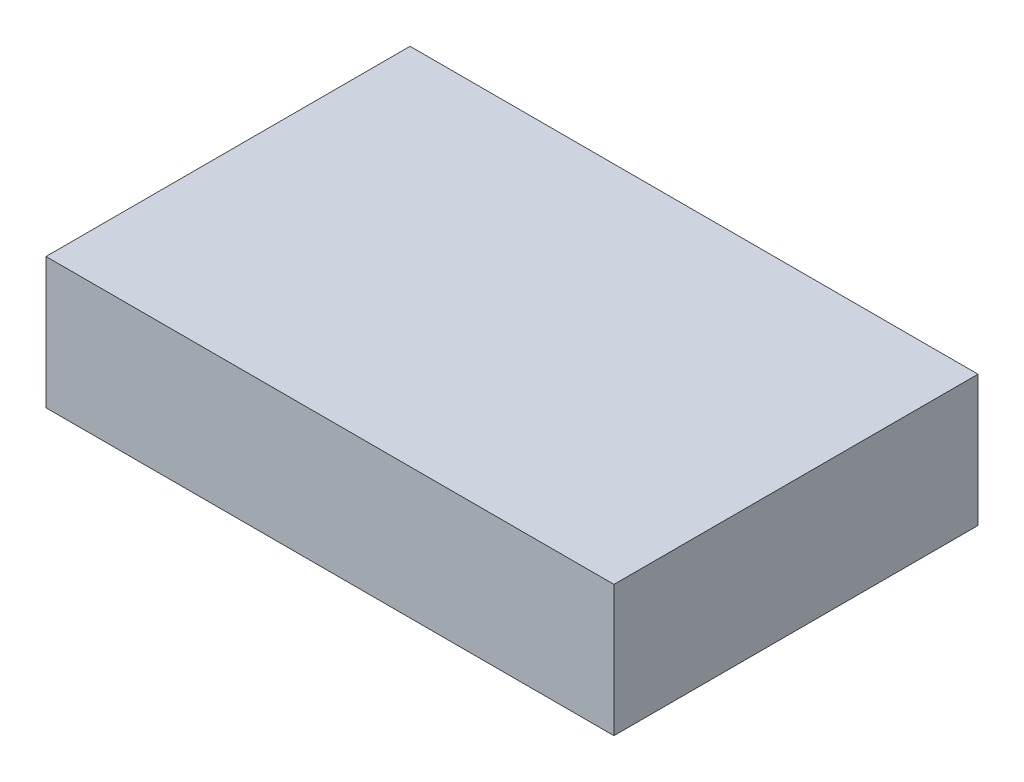
ISO-10303-21;
HEADER;
FILE_DESCRIPTION(('STEP AP214'),'2;1');
FILE_NAME('part.step','',(''),(''),'','','');
FILE_SCHEMA(('AUTOMOTIVE_DESIGN { 1 0 10303 214 1 1 1 1 }'));
ENDSEC;
DATA;
#1=APPLICATION_CONTEXT('core data for automotive mechanical design processes');
#2=APPLICATION_PROTOCOL_DEFINITION('international standard','automotive_design',2000,#1);
#3=PRODUCT_CONTEXT('',#1,'mechanical');
#4=PRODUCT('Part','Part','',(#3));
#5=PRODUCT_RELATED_PRODUCT_CATEGORY('part','',(#4));
#6=PRODUCT_DEFINITION_FORMATION('','',#4);
#7=PRODUCT_DEFINITION_CONTEXT('part definition',#1,'design');
#8=PRODUCT_DEFINITION('design','',#6,#7);
#9=PRODUCT_DEFINITION_SHAPE('','',#8);
#10=(LENGTH_UNIT() NAMED_UNIT(*) SI_UNIT(.MILLI.,.METRE.));
#11=(NAMED_UNIT(*) PLANE_ANGLE_UNIT() SI_UNIT($,.RADIAN.));
#12=(NAMED_UNIT(*) SI_UNIT($,.STERADIAN.) SOLID_ANGLE_UNIT());
#13=UNCERTAINTY_MEASURE_WITH_UNIT(LENGTH_MEASURE(1.E-05),#10,'distance_accuracy_value','');
#14=(GEOMETRIC_REPRESENTATION_CONTEXT(3) GLOBAL_UNCERTAINTY_ASSIGNED_CONTEXT((#13)) GLOBAL_UNIT_ASSIGNED_CONTEXT((#10,
#11,#12)) REPRESENTATION_CONTEXT('',''));
#15=CARTESIAN_POINT('',(0.,0.,0.));
#16=DIRECTION('',(0.,0.,1.));
#17=DIRECTION('',(1.,0.,0.));
#18=AXIS2_PLACEMENT_3D('',#15,#16,#17);
#19=CARTESIAN_POINT('',(-0.975,0.475,-2.626249609619));
#20=DIRECTION('',(0.,1.,0.));
#21=DIRECTION('',(0.,0.,1.));
#22=AXIS2_PLACEMENT_3D('',#19,#20,#21);
#23=PLANE('',#22);
#24=DIRECTION('',(0.,0.,1.));
#25=VECTOR('',#24,1.);
#26=CARTESIAN_POINT('',(-0.975,0.475,-2.626249609619));
#27=LINE('',#26,#25);
#28=CARTESIAN_POINT('',(-0.975,0.475,0.625));
#29=VERTEX_POINT('',#28);
#30=CARTESIAN_POINT('',(-0.975,0.475,-0.625));
#31=VERTEX_POINT('',#30);
#32=EDGE_CURVE('E20',#29,#31,#27,.F.);
#33=ORIENTED_EDGE('',*,*,#32,.F.);
#34=DIRECTION('',(-1.,0.,0.));
#35=VECTOR('',#34,1.);
#36=CARTESIAN_POINT('',(0.,0.475,0.625));
#37=LINE('',#36,#35);
#38=CARTESIAN_POINT('',(0.975,0.475,0.625));
#39=VERTEX_POINT('',#38);
#40=EDGE_CURVE('E79',#29,#39,#37,.F.);
#41=ORIENTED_EDGE('',*,*,#40,.T.);
#42=DIRECTION('',(0.,0.,-1.));
#43=VECTOR('',#42,1.);
#44=CARTESIAN_POINT('',(0.975,0.475,-2.626249609619));
#45=LINE('',#44,#43);
#46=CARTESIAN_POINT('',(0.975,0.475,-0.625));
#47=VERTEX_POINT('',#46);
#48=EDGE_CURVE('E68',#47,#39,#45,.F.);
#49=ORIENTED_EDGE('',*,*,#48,.F.);
#50=DIRECTION('',(-1.,0.,0.));
#51=VECTOR('',#50,1.);
#52=CARTESIAN_POINT('',(0.,0.475,-0.625));
#53=LINE('',#52,#51);
#54=EDGE_CURVE('E56',#31,#47,#53,.F.);
#55=ORIENTED_EDGE('',*,*,#54,.F.);
#56=EDGE_LOOP('',(#33,#41,#49,#55));
#57=FACE_BOUND('',#56,.T.);
#58=ADVANCED_FACE('F17',(#57),#23,.T.);
#59=CARTESIAN_POINT('',(-0.975,0.025,-2.626249609619));
#60=DIRECTION('',(-1.,0.,0.));
#61=DIRECTION('',(0.,0.,1.));
#62=AXIS2_PLACEMENT_3D('',#59,#60,#61);
#63=PLANE('',#62);
#64=DIRECTION('',(0.,0.,-1.));
#65=VECTOR('',#64,1.);
#66=CARTESIAN_POINT('',(-0.975,0.025,-2.626249609619));
#67=LINE('',#66,#65);
#68=CARTESIAN_POINT('',(-0.975,0.025,0.625));
#69=VERTEX_POINT('',#68);
#70=CARTESIAN_POINT('',(-0.975,0.025,-0.625));
#71=VERTEX_POINT('',#70);
#72=EDGE_CURVE('E83',#69,#71,#67,.T.);
#73=ORIENTED_EDGE('',*,*,#72,.F.);
#74=DIRECTION('',(0.,1.,0.));
#75=VECTOR('',#74,1.);
#76=CARTESIAN_POINT('',(-0.975,0.,0.625));
#77=LINE('',#76,#75);
#78=EDGE_CURVE('E65',#69,#29,#77,.T.);
#79=ORIENTED_EDGE('',*,*,#78,.T.);
#80=ORIENTED_EDGE('',*,*,#32,.T.);
#81=DIRECTION('',(0.,1.,0.));
#82=VECTOR('',#81,1.);
#83=CARTESIAN_POINT('',(-0.975,0.,-0.625));
#84=LINE('',#83,#82);
#85=EDGE_CURVE('E62',#71,#31,#84,.T.);
#86=ORIENTED_EDGE('',*,*,#85,.F.);
#87=EDGE_LOOP('',(#73,#79,#80,#86));
#88=FACE_BOUND('',#87,.T.);
#89=ADVANCED_FACE('F61',(#88),#63,.T.);
#90=CARTESIAN_POINT('',(0.,0.,-0.625));
#91=DIRECTION('',(0.,0.,-1.));
#92=DIRECTION('',(-1.,0.,0.));
#93=AXIS2_PLACEMENT_3D('',#90,#91,#92);
#94=PLANE('',#93);
#95=DIRECTION('',(0.,1.,0.));
#96=VECTOR('',#95,1.);
#97=CARTESIAN_POINT('',(0.975,0.025,-0.625));
#98=LINE('',#97,#96);
#99=CARTESIAN_POINT('',(0.975,0.025,-0.625));
#100=VERTEX_POINT('',#99);
#101=EDGE_CURVE('E70',#100,#47,#98,.T.);
#102=ORIENTED_EDGE('',*,*,#101,.F.);
#103=DIRECTION('',(1.,0.,0.));
#104=VECTOR('',#103,1.);
#105=CARTESIAN_POINT('',(-0.975,0.025,-0.625));
#106=LINE('',#105,#104);
#107=EDGE_CURVE('E74',#71,#100,#106,.T.);
#108=ORIENTED_EDGE('',*,*,#107,.F.);
#109=ORIENTED_EDGE('',*,*,#85,.T.);
#110=ORIENTED_EDGE('',*,*,#54,.T.);
#111=EDGE_LOOP('',(#102,#108,#109,#110));
#112=FACE_BOUND('',#111,.T.);
#113=ADVANCED_FACE('F72',(#112),#94,.T.);
#114=CARTESIAN_POINT('',(0.975,0.025,-2.626249609619));
#115=DIRECTION('',(1.,0.,0.));
#116=DIRECTION('',(0.,0.,-1.));
#117=AXIS2_PLACEMENT_3D('',#114,#115,#116);
#118=PLANE('',#117);
#119=ORIENTED_EDGE('',*,*,#48,.T.);
#120=DIRECTION('',(0.,1.,0.));
#121=VECTOR('',#120,1.);
#122=CARTESIAN_POINT('',(0.975,0.,0.625));
#123=LINE('',#122,#121);
#124=CARTESIAN_POINT('',(0.975,0.025,0.625));
#125=VERTEX_POINT('',#124);
#126=EDGE_CURVE('E35',#39,#125,#123,.F.);
#127=ORIENTED_EDGE('',*,*,#126,.T.);
#128=DIRECTION('',(0.,0.,-1.));
#129=VECTOR('',#128,1.);
#130=CARTESIAN_POINT('',(0.975,0.025,-2.626249609619));
#131=LINE('',#130,#129);
#132=EDGE_CURVE('E26',#100,#125,#131,.F.);
#133=ORIENTED_EDGE('',*,*,#132,.F.);
#134=ORIENTED_EDGE('',*,*,#101,.T.);
#135=EDGE_LOOP('',(#119,#127,#133,#134));
#136=FACE_BOUND('',#135,.T.);
#137=ADVANCED_FACE('F89',(#136),#118,.T.);
#138=CARTESIAN_POINT('',(0.,0.,0.625));
#139=DIRECTION('',(0.,0.,-1.));
#140=DIRECTION('',(-1.,0.,0.));
#141=AXIS2_PLACEMENT_3D('',#138,#139,#140);
#142=PLANE('',#141);
#143=DIRECTION('',(1.,0.,0.));
#144=VECTOR('',#143,1.);
#145=CARTESIAN_POINT('',(-0.975,0.025,0.625));
#146=LINE('',#145,#144);
#147=EDGE_CURVE('E11',#125,#69,#146,.F.);
#148=ORIENTED_EDGE('',*,*,#147,.F.);
#149=ORIENTED_EDGE('',*,*,#126,.F.);
#150=ORIENTED_EDGE('',*,*,#40,.F.);
#151=ORIENTED_EDGE('',*,*,#78,.F.);
#152=EDGE_LOOP('',(#148,#149,#150,#151));
#153=FACE_BOUND('',#152,.T.);
#154=ADVANCED_FACE('F91',(#153),#142,.F.);
#155=CARTESIAN_POINT('',(-0.975,0.025,-2.626249609619));
#156=DIRECTION('',(0.,-1.,0.));
#157=DIRECTION('',(0.,0.,-1.));
#158=AXIS2_PLACEMENT_3D('',#155,#156,#157);
#159=PLANE('',#158);
#160=ORIENTED_EDGE('',*,*,#132,.T.);
#161=ORIENTED_EDGE('',*,*,#147,.T.);
#162=ORIENTED_EDGE('',*,*,#72,.T.);
#163=ORIENTED_EDGE('',*,*,#107,.T.);
#164=EDGE_LOOP('',(#160,#161,#162,#163));
#165=FACE_BOUND('',#164,.T.);
#166=ADVANCED_FACE('F88',(#165),#159,.T.);
#167=CLOSED_SHELL('',(#58,#89,#113,#137,#154,#166));
#168=MANIFOLD_SOLID_BREP('B1',#167);
#169=ADVANCED_BREP_SHAPE_REPRESENTATION('',(#18,#168),#14);
#170=SHAPE_DEFINITION_REPRESENTATION(#9,#169);
ENDSEC;
END-ISO-10303-21;
